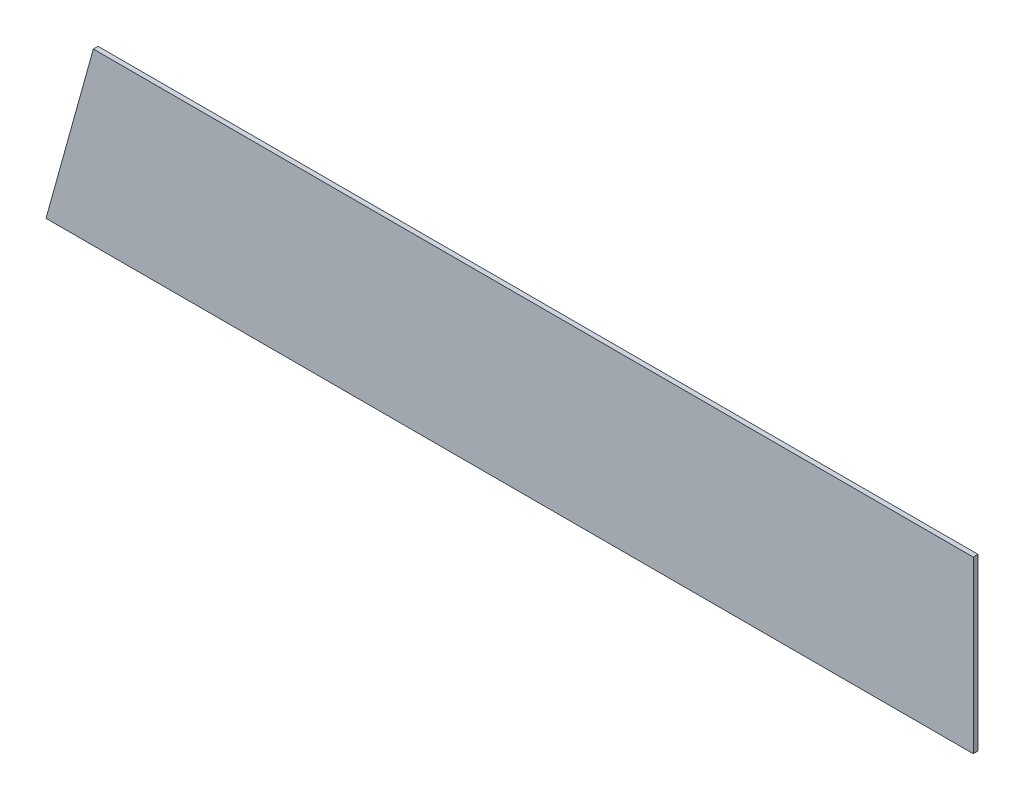
ISO-10303-21;
HEADER;
FILE_DESCRIPTION(('STEP AP214'),'2;1');
FILE_NAME('part.step','',(''),(''),'','','');
FILE_SCHEMA(('AUTOMOTIVE_DESIGN { 1 0 10303 214 1 1 1 1 }'));
ENDSEC;
DATA;
#1=APPLICATION_CONTEXT('core data for automotive mechanical design processes');
#2=APPLICATION_PROTOCOL_DEFINITION('international standard','automotive_design',2000,#1);
#3=PRODUCT_CONTEXT('',#1,'mechanical');
#4=PRODUCT('Part','Part','',(#3));
#5=PRODUCT_RELATED_PRODUCT_CATEGORY('part','',(#4));
#6=PRODUCT_DEFINITION_FORMATION('','',#4);
#7=PRODUCT_DEFINITION_CONTEXT('part definition',#1,'design');
#8=PRODUCT_DEFINITION('design','',#6,#7);
#9=PRODUCT_DEFINITION_SHAPE('','',#8);
#10=(LENGTH_UNIT() NAMED_UNIT(*) SI_UNIT(.MILLI.,.METRE.));
#11=(NAMED_UNIT(*) PLANE_ANGLE_UNIT() SI_UNIT($,.RADIAN.));
#12=(NAMED_UNIT(*) SI_UNIT($,.STERADIAN.) SOLID_ANGLE_UNIT());
#13=UNCERTAINTY_MEASURE_WITH_UNIT(LENGTH_MEASURE(1.E-05),#10,'distance_accuracy_value','');
#14=(GEOMETRIC_REPRESENTATION_CONTEXT(3) GLOBAL_UNCERTAINTY_ASSIGNED_CONTEXT((#13)) GLOBAL_UNIT_ASSIGNED_CONTEXT((#10,
#11,#12)) REPRESENTATION_CONTEXT('',''));
#15=CARTESIAN_POINT('',(0.,0.,0.));
#16=DIRECTION('',(0.,0.,1.));
#17=DIRECTION('',(1.,0.,0.));
#18=AXIS2_PLACEMENT_3D('',#15,#16,#17);
#19=CARTESIAN_POINT('',(54.0093952829619,-9.72169115093314,0.5));
#20=DIRECTION('',(0.,1.,0.));
#21=DIRECTION('',(-1.,0.,0.));
#22=AXIS2_PLACEMENT_3D('',#19,#20,#21);
#23=PLANE('',#22);
#24=DIRECTION('',(1.,0.,0.));
#25=VECTOR('',#24,1.);
#26=CARTESIAN_POINT('',(54.0093952829619,-9.72169115093314,0.));
#27=LINE('',#26,#25);
#28=CARTESIAN_POINT('',(-43.9906047170381,-9.72169115093316,0.));
#29=VERTEX_POINT('',#28);
#30=CARTESIAN_POINT('',(54.0093952829619,-9.72169115093314,0.));
#31=VERTEX_POINT('',#30);
#32=EDGE_CURVE('E102',#29,#31,#27,.T.);
#33=ORIENTED_EDGE('',*,*,#32,.T.);
#34=DIRECTION('',(0.,0.,-1.));
#35=VECTOR('',#34,1.);
#36=CARTESIAN_POINT('',(54.0093952829619,-9.72169115093314,0.5));
#37=LINE('',#36,#35);
#38=CARTESIAN_POINT('',(54.0093952829619,-9.72169115093314,0.5));
#39=VERTEX_POINT('',#38);
#40=EDGE_CURVE('E11',#39,#31,#37,.T.);
#41=ORIENTED_EDGE('',*,*,#40,.F.);
#42=DIRECTION('',(1.,0.,0.));
#43=VECTOR('',#42,1.);
#44=CARTESIAN_POINT('',(54.0093952829619,-9.72169115093314,0.5));
#45=LINE('',#44,#43);
#46=CARTESIAN_POINT('',(-43.9906047170381,-9.72169115093316,0.5));
#47=VERTEX_POINT('',#46);
#48=EDGE_CURVE('E90',#47,#39,#45,.T.);
#49=ORIENTED_EDGE('',*,*,#48,.F.);
#50=DIRECTION('',(0.,0.,-1.));
#51=VECTOR('',#50,1.);
#52=CARTESIAN_POINT('',(-43.9906047170381,-9.72169115093316,0.5));
#53=LINE('',#52,#51);
#54=EDGE_CURVE('E98',#47,#29,#53,.T.);
#55=ORIENTED_EDGE('',*,*,#54,.T.);
#56=EDGE_LOOP('',(#33,#41,#49,#55));
#57=FACE_BOUND('',#56,.T.);
#58=ADVANCED_FACE('F39',(#57),#23,.F.);
#59=CARTESIAN_POINT('',(54.0093952829619,8.27830884906685,0.5));
#60=DIRECTION('',(-1.,0.,0.));
#61=DIRECTION('',(0.,0.,1.));
#62=AXIS2_PLACEMENT_3D('',#59,#60,#61);
#63=PLANE('',#62);
#64=DIRECTION('',(0.,1.,0.));
#65=VECTOR('',#64,1.);
#66=CARTESIAN_POINT('',(54.0093952829619,8.27830884906685,0.));
#67=LINE('',#66,#65);
#68=CARTESIAN_POINT('',(54.0093952829619,8.27830884906685,0.));
#69=VERTEX_POINT('',#68);
#70=EDGE_CURVE('E94',#31,#69,#67,.T.);
#71=ORIENTED_EDGE('',*,*,#70,.T.);
#72=DIRECTION('',(0.,0.,-1.));
#73=VECTOR('',#72,1.);
#74=CARTESIAN_POINT('',(54.0093952829619,8.27830884906685,0.5));
#75=LINE('',#74,#73);
#76=CARTESIAN_POINT('',(54.0093952829619,8.27830884906685,0.5));
#77=VERTEX_POINT('',#76);
#78=EDGE_CURVE('E47',#77,#69,#75,.T.);
#79=ORIENTED_EDGE('',*,*,#78,.F.);
#80=DIRECTION('',(0.,1.,0.));
#81=VECTOR('',#80,1.);
#82=CARTESIAN_POINT('',(54.0093952829619,8.27830884906685,0.5));
#83=LINE('',#82,#81);
#84=EDGE_CURVE('E85',#39,#77,#83,.T.);
#85=ORIENTED_EDGE('',*,*,#84,.F.);
#86=ORIENTED_EDGE('',*,*,#40,.T.);
#87=EDGE_LOOP('',(#71,#79,#85,#86));
#88=FACE_BOUND('',#87,.T.);
#89=ADVANCED_FACE('F93',(#88),#63,.F.);
#90=CARTESIAN_POINT('',(-38.9906047170381,8.27830884906685,0.5));
#91=DIRECTION('',(0.,-1.,0.));
#92=DIRECTION('',(0.,0.,-1.));
#93=AXIS2_PLACEMENT_3D('',#90,#91,#92);
#94=PLANE('',#93);
#95=DIRECTION('',(-1.,0.,0.));
#96=VECTOR('',#95,1.);
#97=CARTESIAN_POINT('',(-38.9906047170381,8.27830884906685,0.));
#98=LINE('',#97,#96);
#99=CARTESIAN_POINT('',(-38.9906047170381,8.27830884906685,0.));
#100=VERTEX_POINT('',#99);
#101=EDGE_CURVE('E72',#69,#100,#98,.T.);
#102=ORIENTED_EDGE('',*,*,#101,.T.);
#103=DIRECTION('',(0.,0.,-1.));
#104=VECTOR('',#103,1.);
#105=CARTESIAN_POINT('',(-38.9906047170381,8.27830884906685,0.5));
#106=LINE('',#105,#104);
#107=CARTESIAN_POINT('',(-38.9906047170381,8.27830884906685,0.5));
#108=VERTEX_POINT('',#107);
#109=EDGE_CURVE('E95',#108,#100,#106,.T.);
#110=ORIENTED_EDGE('',*,*,#109,.F.);
#111=DIRECTION('',(-1.,0.,0.));
#112=VECTOR('',#111,1.);
#113=CARTESIAN_POINT('',(-38.9906047170381,8.27830884906685,0.5));
#114=LINE('',#113,#112);
#115=EDGE_CURVE('E88',#77,#108,#114,.T.);
#116=ORIENTED_EDGE('',*,*,#115,.F.);
#117=ORIENTED_EDGE('',*,*,#78,.T.);
#118=EDGE_LOOP('',(#102,#110,#116,#117));
#119=FACE_BOUND('',#118,.T.);
#120=ADVANCED_FACE('F96',(#119),#94,.F.);
#121=CARTESIAN_POINT('',(-38.9906047170381,8.27830884906685,0.5));
#122=DIRECTION('',(0.963517909629941,-0.267643863786095,0.));
#123=DIRECTION('',(0.267643863786095,0.963517909629941,0.));
#124=AXIS2_PLACEMENT_3D('',#121,#122,#123);
#125=PLANE('',#124);
#126=DIRECTION('',(-0.267643863786095,-0.963517909629941,0.));
#127=VECTOR('',#126,1.);
#128=CARTESIAN_POINT('',(-38.9906047170381,8.27830884906685,0.));
#129=LINE('',#128,#127);
#130=EDGE_CURVE('E78',#100,#29,#129,.T.);
#131=ORIENTED_EDGE('',*,*,#130,.T.);
#132=ORIENTED_EDGE('',*,*,#54,.F.);
#133=DIRECTION('',(-0.267643863786095,-0.963517909629941,0.));
#134=VECTOR('',#133,1.);
#135=CARTESIAN_POINT('',(-38.9906047170381,8.27830884906685,0.5));
#136=LINE('',#135,#134);
#137=EDGE_CURVE('E55',#108,#47,#136,.T.);
#138=ORIENTED_EDGE('',*,*,#137,.F.);
#139=ORIENTED_EDGE('',*,*,#109,.T.);
#140=EDGE_LOOP('',(#131,#132,#138,#139));
#141=FACE_BOUND('',#140,.T.);
#142=ADVANCED_FACE('F109',(#141),#125,.F.);
#143=CARTESIAN_POINT('',(0.,0.,0.5));
#144=DIRECTION('',(0.,0.,1.));
#145=DIRECTION('',(1.,0.,0.));
#146=AXIS2_PLACEMENT_3D('',#143,#144,#145);
#147=PLANE('',#146);
#148=ORIENTED_EDGE('',*,*,#48,.T.);
#149=ORIENTED_EDGE('',*,*,#84,.T.);
#150=ORIENTED_EDGE('',*,*,#115,.T.);
#151=ORIENTED_EDGE('',*,*,#137,.T.);
#152=EDGE_LOOP('',(#148,#149,#150,#151));
#153=FACE_BOUND('',#152,.T.);
#154=ADVANCED_FACE('F86',(#153),#147,.T.);
#155=CARTESIAN_POINT('',(0.,0.,0.));
#156=DIRECTION('',(0.,0.,1.));
#157=DIRECTION('',(1.,0.,0.));
#158=AXIS2_PLACEMENT_3D('',#155,#156,#157);
#159=PLANE('',#158);
#160=ORIENTED_EDGE('',*,*,#32,.F.);
#161=ORIENTED_EDGE('',*,*,#130,.F.);
#162=ORIENTED_EDGE('',*,*,#101,.F.);
#163=ORIENTED_EDGE('',*,*,#70,.F.);
#164=EDGE_LOOP('',(#160,#161,#162,#163));
#165=FACE_BOUND('',#164,.T.);
#166=ADVANCED_FACE('F112',(#165),#159,.F.);
#167=CLOSED_SHELL('',(#58,#89,#120,#142,#154,#166));
#168=MANIFOLD_SOLID_BREP('B2',#167);
#169=ADVANCED_BREP_SHAPE_REPRESENTATION('',(#18,#168),#14);
#170=SHAPE_DEFINITION_REPRESENTATION(#9,#169);
ENDSEC;
END-ISO-10303-21;
